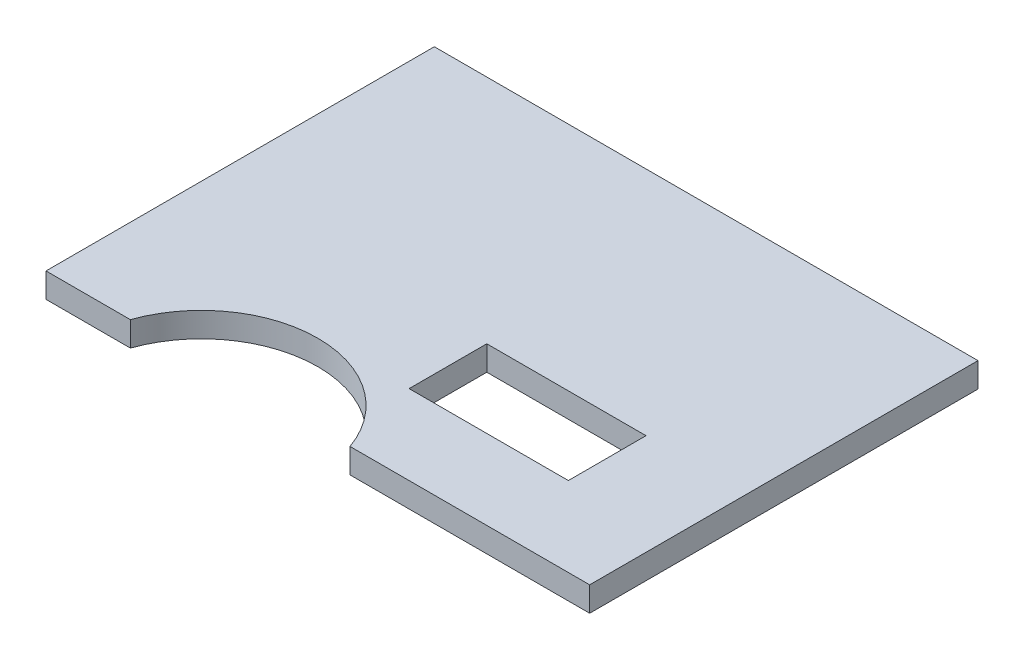
ISO-10303-21;
HEADER;
FILE_DESCRIPTION(('STEP AP214'),'2;1');
FILE_NAME('part.step','',(''),(''),'','','');
FILE_SCHEMA(('AUTOMOTIVE_DESIGN { 1 0 10303 214 1 1 1 1 }'));
ENDSEC;
DATA;
#1=APPLICATION_CONTEXT('core data for automotive mechanical design processes');
#2=APPLICATION_PROTOCOL_DEFINITION('international standard','automotive_design',2000,#1);
#3=PRODUCT_CONTEXT('',#1,'mechanical');
#4=PRODUCT('Part','Part','',(#3));
#5=PRODUCT_RELATED_PRODUCT_CATEGORY('part','',(#4));
#6=PRODUCT_DEFINITION_FORMATION('','',#4);
#7=PRODUCT_DEFINITION_CONTEXT('part definition',#1,'design');
#8=PRODUCT_DEFINITION('design','',#6,#7);
#9=PRODUCT_DEFINITION_SHAPE('','',#8);
#10=(LENGTH_UNIT() NAMED_UNIT(*) SI_UNIT(.MILLI.,.METRE.));
#11=(NAMED_UNIT(*) PLANE_ANGLE_UNIT() SI_UNIT($,.RADIAN.));
#12=(NAMED_UNIT(*) SI_UNIT($,.STERADIAN.) SOLID_ANGLE_UNIT());
#13=UNCERTAINTY_MEASURE_WITH_UNIT(LENGTH_MEASURE(1.E-05),#10,'distance_accuracy_value','');
#14=(GEOMETRIC_REPRESENTATION_CONTEXT(3) GLOBAL_UNCERTAINTY_ASSIGNED_CONTEXT((#13)) GLOBAL_UNIT_ASSIGNED_CONTEXT((#10,
#11,#12)) REPRESENTATION_CONTEXT('',''));
#15=CARTESIAN_POINT('',(0.,0.,0.));
#16=DIRECTION('',(0.,0.,1.));
#17=DIRECTION('',(1.,0.,0.));
#18=AXIS2_PLACEMENT_3D('',#15,#16,#17);
#19=CARTESIAN_POINT('',(0.,6.35,0.));
#20=DIRECTION('',(0.,0.,-1.));
#21=DIRECTION('',(-1.,0.,0.));
#22=AXIS2_PLACEMENT_3D('',#19,#20,#21);
#23=PLANE('',#22);
#24=DIRECTION('',(1.,0.,0.));
#25=VECTOR('',#24,1.);
#26=CARTESIAN_POINT('',(0.,0.,0.));
#27=LINE('',#26,#25);
#28=CARTESIAN_POINT('',(0.,0.,0.));
#29=VERTEX_POINT('',#28);
#30=CARTESIAN_POINT('',(21.7157287525381,0.,0.));
#31=VERTEX_POINT('',#30);
#32=EDGE_CURVE('E143',#29,#31,#27,.T.);
#33=ORIENTED_EDGE('',*,*,#32,.T.);
#34=DIRECTION('',(0.,1.,0.));
#35=VECTOR('',#34,1.);
#36=CARTESIAN_POINT('',(21.7157287525381,-3.65,0.));
#37=LINE('',#36,#35);
#38=CARTESIAN_POINT('',(21.7157287525381,6.35,0.));
#39=VERTEX_POINT('',#38);
#40=EDGE_CURVE('E46',#31,#39,#37,.T.);
#41=ORIENTED_EDGE('',*,*,#40,.T.);
#42=DIRECTION('',(1.,0.,0.));
#43=VECTOR('',#42,1.);
#44=CARTESIAN_POINT('',(0.,6.35,0.));
#45=LINE('',#44,#43);
#46=CARTESIAN_POINT('',(0.,6.35,0.));
#47=VERTEX_POINT('',#46);
#48=EDGE_CURVE('E121',#47,#39,#45,.T.);
#49=ORIENTED_EDGE('',*,*,#48,.F.);
#50=DIRECTION('',(0.,-1.,0.));
#51=VECTOR('',#50,1.);
#52=CARTESIAN_POINT('',(0.,6.35,0.));
#53=LINE('',#52,#51);
#54=EDGE_CURVE('E155',#47,#29,#53,.T.);
#55=ORIENTED_EDGE('',*,*,#54,.T.);
#56=EDGE_LOOP('',(#33,#41,#49,#55));
#57=FACE_BOUND('',#56,.T.);
#58=ADVANCED_FACE('F32',(#57),#23,.F.);
#59=CARTESIAN_POINT('',(0.,6.35,0.));
#60=DIRECTION('',(1.,0.,0.));
#61=DIRECTION('',(0.,0.,-1.));
#62=AXIS2_PLACEMENT_3D('',#59,#60,#61);
#63=PLANE('',#62);
#64=DIRECTION('',(0.,0.,1.));
#65=VECTOR('',#64,1.);
#66=CARTESIAN_POINT('',(0.,0.,0.));
#67=LINE('',#66,#65);
#68=CARTESIAN_POINT('',(0.,0.,-100.));
#69=VERTEX_POINT('',#68);
#70=EDGE_CURVE('E138',#69,#29,#67,.T.);
#71=ORIENTED_EDGE('',*,*,#70,.T.);
#72=ORIENTED_EDGE('',*,*,#54,.F.);
#73=DIRECTION('',(0.,0.,1.));
#74=VECTOR('',#73,1.);
#75=CARTESIAN_POINT('',(0.,6.35,0.));
#76=LINE('',#75,#74);
#77=CARTESIAN_POINT('',(0.,6.35,-100.));
#78=VERTEX_POINT('',#77);
#79=EDGE_CURVE('E127',#78,#47,#76,.T.);
#80=ORIENTED_EDGE('',*,*,#79,.F.);
#81=DIRECTION('',(0.,-1.,0.));
#82=VECTOR('',#81,1.);
#83=CARTESIAN_POINT('',(0.,6.35,-100.));
#84=LINE('',#83,#82);
#85=EDGE_CURVE('E137',#78,#69,#84,.T.);
#86=ORIENTED_EDGE('',*,*,#85,.T.);
#87=EDGE_LOOP('',(#71,#72,#80,#86));
#88=FACE_BOUND('',#87,.T.);
#89=ADVANCED_FACE('F34',(#88),#63,.F.);
#90=CARTESIAN_POINT('',(78.2842712474619,6.35,0.));
#91=VERTEX_POINT('',#90);
#92=CARTESIAN_POINT('',(140.,6.35,0.));
#93=VERTEX_POINT('',#92);
#94=EDGE_CURVE('E118',#91,#93,#45,.T.);
#95=ORIENTED_EDGE('',*,*,#94,.F.);
#96=DIRECTION('',(0.,1.,0.));
#97=VECTOR('',#96,1.);
#98=CARTESIAN_POINT('',(78.2842712474619,-3.65,0.));
#99=LINE('',#98,#97);
#100=CARTESIAN_POINT('',(78.2842712474619,0.,0.));
#101=VERTEX_POINT('',#100);
#102=EDGE_CURVE('E107',#91,#101,#99,.F.);
#103=ORIENTED_EDGE('',*,*,#102,.T.);
#104=CARTESIAN_POINT('',(140.,0.,0.));
#105=VERTEX_POINT('',#104);
#106=EDGE_CURVE('E141',#101,#105,#27,.T.);
#107=ORIENTED_EDGE('',*,*,#106,.T.);
#108=DIRECTION('',(0.,-1.,0.));
#109=VECTOR('',#108,1.);
#110=CARTESIAN_POINT('',(140.,6.35,0.));
#111=LINE('',#110,#109);
#112=EDGE_CURVE('E125',#93,#105,#111,.T.);
#113=ORIENTED_EDGE('',*,*,#112,.F.);
#114=EDGE_LOOP('',(#95,#103,#107,#113));
#115=FACE_BOUND('',#114,.T.);
#116=ADVANCED_FACE('F123',(#115),#23,.F.);
#117=CARTESIAN_POINT('',(140.,6.35,0.));
#118=DIRECTION('',(-1.,0.,0.));
#119=DIRECTION('',(0.,0.,1.));
#120=AXIS2_PLACEMENT_3D('',#117,#118,#119);
#121=PLANE('',#120);
#122=DIRECTION('',(0.,0.,-1.));
#123=VECTOR('',#122,1.);
#124=CARTESIAN_POINT('',(140.,0.,0.));
#125=LINE('',#124,#123);
#126=CARTESIAN_POINT('',(140.,0.,-100.));
#127=VERTEX_POINT('',#126);
#128=EDGE_CURVE('E146',#105,#127,#125,.T.);
#129=ORIENTED_EDGE('',*,*,#128,.T.);
#130=DIRECTION('',(0.,-1.,0.));
#131=VECTOR('',#130,1.);
#132=CARTESIAN_POINT('',(140.,6.35,-100.));
#133=LINE('',#132,#131);
#134=CARTESIAN_POINT('',(140.,6.35,-100.));
#135=VERTEX_POINT('',#134);
#136=EDGE_CURVE('E151',#135,#127,#133,.T.);
#137=ORIENTED_EDGE('',*,*,#136,.F.);
#138=DIRECTION('',(0.,0.,-1.));
#139=VECTOR('',#138,1.);
#140=CARTESIAN_POINT('',(140.,6.35,0.));
#141=LINE('',#140,#139);
#142=EDGE_CURVE('E129',#93,#135,#141,.T.);
#143=ORIENTED_EDGE('',*,*,#142,.F.);
#144=ORIENTED_EDGE('',*,*,#112,.T.);
#145=EDGE_LOOP('',(#129,#137,#143,#144));
#146=FACE_BOUND('',#145,.T.);
#147=ADVANCED_FACE('F205',(#146),#121,.F.);
#148=CARTESIAN_POINT('',(0.,6.35,-100.));
#149=DIRECTION('',(0.,0.,1.));
#150=DIRECTION('',(1.,0.,0.));
#151=AXIS2_PLACEMENT_3D('',#148,#149,#150);
#152=PLANE('',#151);
#153=DIRECTION('',(-1.,0.,0.));
#154=VECTOR('',#153,1.);
#155=CARTESIAN_POINT('',(0.,0.,-100.));
#156=LINE('',#155,#154);
#157=EDGE_CURVE('E130',#127,#69,#156,.T.);
#158=ORIENTED_EDGE('',*,*,#157,.T.);
#159=ORIENTED_EDGE('',*,*,#85,.F.);
#160=DIRECTION('',(-1.,0.,0.));
#161=VECTOR('',#160,1.);
#162=CARTESIAN_POINT('',(0.,6.35,-100.));
#163=LINE('',#162,#161);
#164=EDGE_CURVE('E135',#135,#78,#163,.T.);
#165=ORIENTED_EDGE('',*,*,#164,.F.);
#166=ORIENTED_EDGE('',*,*,#136,.T.);
#167=EDGE_LOOP('',(#158,#159,#165,#166));
#168=FACE_BOUND('',#167,.T.);
#169=ADVANCED_FACE('F211',(#168),#152,.F.);
#170=CARTESIAN_POINT('',(0.,6.35,0.));
#171=DIRECTION('',(0.,-1.,0.));
#172=DIRECTION('',(0.,0.,-1.));
#173=AXIS2_PLACEMENT_3D('',#170,#171,#172);
#174=PLANE('',#173);
#175=DIRECTION('',(1.,0.,0.));
#176=VECTOR('',#175,1.);
#177=CARTESIAN_POINT('',(73.,6.35,-20.51));
#178=LINE('',#177,#176);
#179=CARTESIAN_POINT('',(73.,6.35,-20.51));
#180=VERTEX_POINT('',#179);
#181=CARTESIAN_POINT('',(114.,6.35,-20.51));
#182=VERTEX_POINT('',#181);
#183=EDGE_CURVE('E193',#180,#182,#178,.T.);
#184=ORIENTED_EDGE('',*,*,#183,.F.);
#185=DIRECTION('',(0.,0.,1.));
#186=VECTOR('',#185,1.);
#187=CARTESIAN_POINT('',(73.,6.35,-40.51));
#188=LINE('',#187,#186);
#189=CARTESIAN_POINT('',(73.,6.35,-40.51));
#190=VERTEX_POINT('',#189);
#191=EDGE_CURVE('E54',#190,#180,#188,.T.);
#192=ORIENTED_EDGE('',*,*,#191,.F.);
#193=DIRECTION('',(-1.,0.,0.));
#194=VECTOR('',#193,1.);
#195=CARTESIAN_POINT('',(73.,6.35,-40.51));
#196=LINE('',#195,#194);
#197=CARTESIAN_POINT('',(114.,6.35,-40.51));
#198=VERTEX_POINT('',#197);
#199=EDGE_CURVE('E176',#198,#190,#196,.T.);
#200=ORIENTED_EDGE('',*,*,#199,.F.);
#201=DIRECTION('',(0.,0.,-1.));
#202=VECTOR('',#201,1.);
#203=CARTESIAN_POINT('',(114.,6.35,-40.51));
#204=LINE('',#203,#202);
#205=EDGE_CURVE('E187',#182,#198,#204,.T.);
#206=ORIENTED_EDGE('',*,*,#205,.F.);
#207=EDGE_LOOP('',(#184,#192,#200,#206));
#208=FACE_BOUND('',#207,.T.);
#209=ORIENTED_EDGE('',*,*,#48,.T.);
#210=CARTESIAN_POINT('',(50.,6.35,9.99999999999999));
#211=DIRECTION('',(0.,1.,0.));
#212=DIRECTION('',(0.,0.,1.));
#213=AXIS2_PLACEMENT_3D('',#210,#211,#212);
#214=CIRCLE('',#213,30.);
#215=EDGE_CURVE('E110',#91,#39,#214,.T.);
#216=ORIENTED_EDGE('',*,*,#215,.F.);
#217=ORIENTED_EDGE('',*,*,#94,.T.);
#218=ORIENTED_EDGE('',*,*,#142,.T.);
#219=ORIENTED_EDGE('',*,*,#164,.T.);
#220=ORIENTED_EDGE('',*,*,#79,.T.);
#221=EDGE_LOOP('',(#209,#216,#217,#218,#219,#220));
#222=FACE_BOUND('',#221,.T.);
#223=ADVANCED_FACE('F117',(#208,#222),#174,.F.);
#224=CARTESIAN_POINT('',(0.,0.,0.));
#225=DIRECTION('',(0.,-1.,0.));
#226=DIRECTION('',(0.,0.,-1.));
#227=AXIS2_PLACEMENT_3D('',#224,#225,#226);
#228=PLANE('',#227);
#229=CARTESIAN_POINT('',(50.,0.,9.99999999999999));
#230=DIRECTION('',(0.,-1.,0.));
#231=DIRECTION('',(0.,0.,-1.));
#232=AXIS2_PLACEMENT_3D('',#229,#230,#231);
#233=CIRCLE('',#232,30.);
#234=EDGE_CURVE('E11',#31,#101,#233,.T.);
#235=ORIENTED_EDGE('',*,*,#234,.F.);
#236=ORIENTED_EDGE('',*,*,#32,.F.);
#237=ORIENTED_EDGE('',*,*,#70,.F.);
#238=ORIENTED_EDGE('',*,*,#157,.F.);
#239=ORIENTED_EDGE('',*,*,#128,.F.);
#240=ORIENTED_EDGE('',*,*,#106,.F.);
#241=EDGE_LOOP('',(#235,#236,#237,#238,#239,#240));
#242=FACE_BOUND('',#241,.T.);
#243=DIRECTION('',(0.,0.,-1.));
#244=VECTOR('',#243,1.);
#245=CARTESIAN_POINT('',(73.,0.,0.));
#246=LINE('',#245,#244);
#247=CARTESIAN_POINT('',(73.,0.,-20.51));
#248=VERTEX_POINT('',#247);
#249=CARTESIAN_POINT('',(73.,0.,-40.51));
#250=VERTEX_POINT('',#249);
#251=EDGE_CURVE('E40',#248,#250,#246,.T.);
#252=ORIENTED_EDGE('',*,*,#251,.F.);
#253=DIRECTION('',(-1.,0.,0.));
#254=VECTOR('',#253,1.);
#255=CARTESIAN_POINT('',(0.,0.,-20.51));
#256=LINE('',#255,#254);
#257=CARTESIAN_POINT('',(114.,0.,-20.51));
#258=VERTEX_POINT('',#257);
#259=EDGE_CURVE('E158',#258,#248,#256,.T.);
#260=ORIENTED_EDGE('',*,*,#259,.F.);
#261=DIRECTION('',(0.,0.,1.));
#262=VECTOR('',#261,1.);
#263=CARTESIAN_POINT('',(114.,0.,0.));
#264=LINE('',#263,#262);
#265=CARTESIAN_POINT('',(114.,0.,-40.51));
#266=VERTEX_POINT('',#265);
#267=EDGE_CURVE('E160',#266,#258,#264,.T.);
#268=ORIENTED_EDGE('',*,*,#267,.F.);
#269=DIRECTION('',(1.,0.,0.));
#270=VECTOR('',#269,1.);
#271=CARTESIAN_POINT('',(0.,0.,-40.51));
#272=LINE('',#271,#270);
#273=EDGE_CURVE('E163',#250,#266,#272,.T.);
#274=ORIENTED_EDGE('',*,*,#273,.F.);
#275=EDGE_LOOP('',(#252,#260,#268,#274));
#276=FACE_BOUND('',#275,.T.);
#277=ADVANCED_FACE('F180',(#242,#276),#228,.T.);
#278=CARTESIAN_POINT('',(73.,-3.65,-40.51));
#279=DIRECTION('',(-1.,0.,0.));
#280=DIRECTION('',(0.,0.,1.));
#281=AXIS2_PLACEMENT_3D('',#278,#279,#280);
#282=PLANE('',#281);
#283=ORIENTED_EDGE('',*,*,#251,.T.);
#284=DIRECTION('',(0.,1.,0.));
#285=VECTOR('',#284,1.);
#286=CARTESIAN_POINT('',(73.,-3.65,-40.51));
#287=LINE('',#286,#285);
#288=EDGE_CURVE('E142',#250,#190,#287,.T.);
#289=ORIENTED_EDGE('',*,*,#288,.T.);
#290=ORIENTED_EDGE('',*,*,#191,.T.);
#291=DIRECTION('',(0.,1.,0.));
#292=VECTOR('',#291,1.);
#293=CARTESIAN_POINT('',(73.,-3.65,-20.51));
#294=LINE('',#293,#292);
#295=EDGE_CURVE('E168',#248,#180,#294,.T.);
#296=ORIENTED_EDGE('',*,*,#295,.F.);
#297=EDGE_LOOP('',(#283,#289,#290,#296));
#298=FACE_BOUND('',#297,.T.);
#299=ADVANCED_FACE('F166',(#298),#282,.F.);
#300=CARTESIAN_POINT('',(73.,-3.65,-40.51));
#301=DIRECTION('',(0.,0.,-1.));
#302=DIRECTION('',(-1.,0.,0.));
#303=AXIS2_PLACEMENT_3D('',#300,#301,#302);
#304=PLANE('',#303);
#305=ORIENTED_EDGE('',*,*,#273,.T.);
#306=DIRECTION('',(0.,1.,0.));
#307=VECTOR('',#306,1.);
#308=CARTESIAN_POINT('',(114.,-3.65,-40.51));
#309=LINE('',#308,#307);
#310=EDGE_CURVE('E177',#266,#198,#309,.T.);
#311=ORIENTED_EDGE('',*,*,#310,.T.);
#312=ORIENTED_EDGE('',*,*,#199,.T.);
#313=ORIENTED_EDGE('',*,*,#288,.F.);
#314=EDGE_LOOP('',(#305,#311,#312,#313));
#315=FACE_BOUND('',#314,.T.);
#316=ADVANCED_FACE('F173',(#315),#304,.F.);
#317=CARTESIAN_POINT('',(114.,-3.65,-40.51));
#318=DIRECTION('',(1.,0.,0.));
#319=DIRECTION('',(0.,0.,-1.));
#320=AXIS2_PLACEMENT_3D('',#317,#318,#319);
#321=PLANE('',#320);
#322=ORIENTED_EDGE('',*,*,#267,.T.);
#323=DIRECTION('',(0.,1.,0.));
#324=VECTOR('',#323,1.);
#325=CARTESIAN_POINT('',(114.,-3.65,-20.51));
#326=LINE('',#325,#324);
#327=EDGE_CURVE('E184',#258,#182,#326,.T.);
#328=ORIENTED_EDGE('',*,*,#327,.T.);
#329=ORIENTED_EDGE('',*,*,#205,.T.);
#330=ORIENTED_EDGE('',*,*,#310,.F.);
#331=EDGE_LOOP('',(#322,#328,#329,#330));
#332=FACE_BOUND('',#331,.T.);
#333=ADVANCED_FACE('F182',(#332),#321,.F.);
#334=CARTESIAN_POINT('',(73.,-3.65,-20.51));
#335=DIRECTION('',(0.,0.,1.));
#336=DIRECTION('',(1.,0.,0.));
#337=AXIS2_PLACEMENT_3D('',#334,#335,#336);
#338=PLANE('',#337);
#339=ORIENTED_EDGE('',*,*,#259,.T.);
#340=ORIENTED_EDGE('',*,*,#295,.T.);
#341=ORIENTED_EDGE('',*,*,#183,.T.);
#342=ORIENTED_EDGE('',*,*,#327,.F.);
#343=EDGE_LOOP('',(#339,#340,#341,#342));
#344=FACE_BOUND('',#343,.T.);
#345=ADVANCED_FACE('F232',(#344),#338,.F.);
#346=CARTESIAN_POINT('',(50.,-3.65,9.99999999999999));
#347=DIRECTION('',(0.,1.,0.));
#348=DIRECTION('',(0.,0.,1.));
#349=AXIS2_PLACEMENT_3D('',#346,#347,#348);
#350=CYLINDRICAL_SURFACE('',#349,30.);
#351=ORIENTED_EDGE('',*,*,#234,.T.);
#352=ORIENTED_EDGE('',*,*,#102,.F.);
#353=ORIENTED_EDGE('',*,*,#215,.T.);
#354=ORIENTED_EDGE('',*,*,#40,.F.);
#355=EDGE_LOOP('',(#351,#352,#353,#354));
#356=FACE_BOUND('',#355,.T.);
#357=ADVANCED_FACE('F109',(#356),#350,.F.);
#358=CLOSED_SHELL('',(#58,#89,#116,#147,#169,#223,#277,#299,#316,#333,#345,#357));
#359=MANIFOLD_SOLID_BREP('B2',#358);
#360=ADVANCED_BREP_SHAPE_REPRESENTATION('',(#18,#359),#14);
#361=SHAPE_DEFINITION_REPRESENTATION(#9,#360);
ENDSEC;
END-ISO-10303-21;
